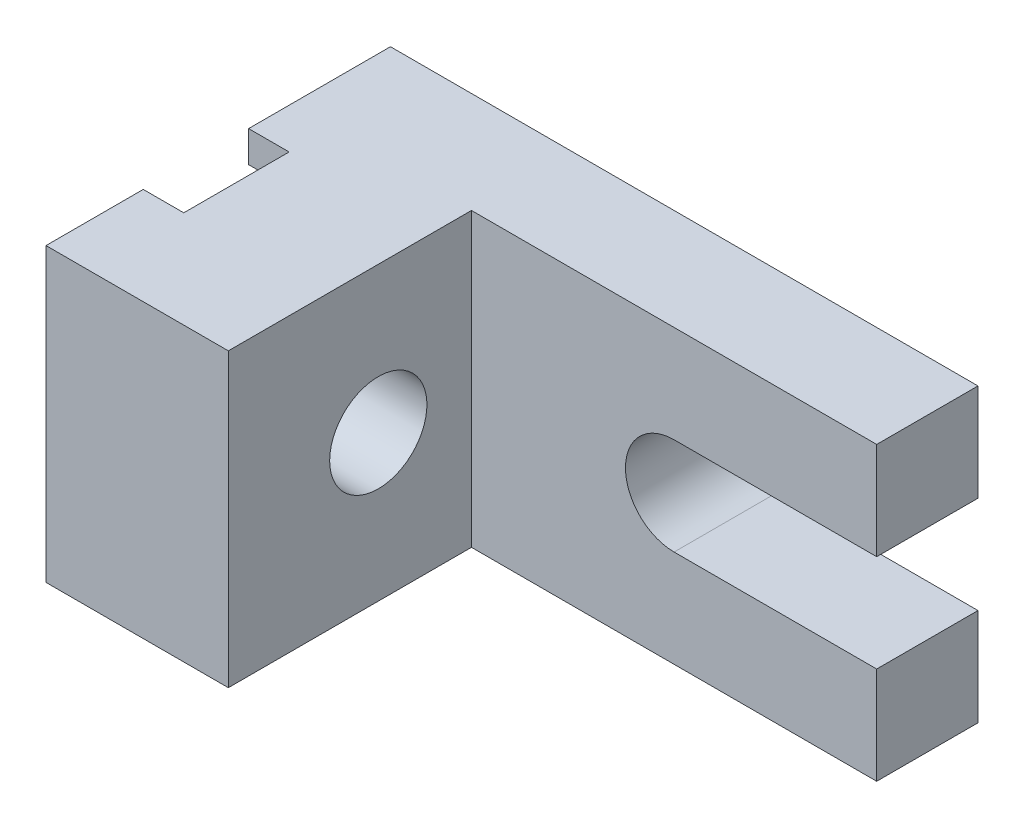
ISO-10303-21;
HEADER;
FILE_DESCRIPTION(('STEP AP214'),'2;1');
FILE_NAME('part.step','',(''),(''),'','','');
FILE_SCHEMA(('AUTOMOTIVE_DESIGN { 1 0 10303 214 1 1 1 1 }'));
ENDSEC;
DATA;
#1=APPLICATION_CONTEXT('core data for automotive mechanical design processes');
#2=APPLICATION_PROTOCOL_DEFINITION('international standard','automotive_design',2000,#1);
#3=PRODUCT_CONTEXT('',#1,'mechanical');
#4=PRODUCT('Part','Part','',(#3));
#5=PRODUCT_RELATED_PRODUCT_CATEGORY('part','',(#4));
#6=PRODUCT_DEFINITION_FORMATION('','',#4);
#7=PRODUCT_DEFINITION_CONTEXT('part definition',#1,'design');
#8=PRODUCT_DEFINITION('design','',#6,#7);
#9=PRODUCT_DEFINITION_SHAPE('','',#8);
#10=(LENGTH_UNIT() NAMED_UNIT(*) SI_UNIT(.MILLI.,.METRE.));
#11=(NAMED_UNIT(*) PLANE_ANGLE_UNIT() SI_UNIT($,.RADIAN.));
#12=(NAMED_UNIT(*) SI_UNIT($,.STERADIAN.) SOLID_ANGLE_UNIT());
#13=UNCERTAINTY_MEASURE_WITH_UNIT(LENGTH_MEASURE(1.E-05),#10,'distance_accuracy_value','');
#14=(GEOMETRIC_REPRESENTATION_CONTEXT(3) GLOBAL_UNCERTAINTY_ASSIGNED_CONTEXT((#13)) GLOBAL_UNIT_ASSIGNED_CONTEXT((#10,
#11,#12)) REPRESENTATION_CONTEXT('',''));
#15=CARTESIAN_POINT('',(0.,0.,0.));
#16=DIRECTION('',(0.,0.,1.));
#17=DIRECTION('',(1.,0.,0.));
#18=AXIS2_PLACEMENT_3D('',#15,#16,#17);
#19=CARTESIAN_POINT('',(-9.99999999999999,-72.,35.));
#20=DIRECTION('',(0.,0.,-1.));
#21=DIRECTION('',(-1.,0.,0.));
#22=AXIS2_PLACEMENT_3D('',#19,#20,#21);
#23=PLANE('',#22);
#24=DIRECTION('',(0.,1.,0.));
#25=VECTOR('',#24,1.);
#26=CARTESIAN_POINT('',(0.,-72.,35.));
#27=LINE('',#26,#25);
#28=CARTESIAN_POINT('',(0.,-72.,35.));
#29=VERTEX_POINT('',#28);
#30=CARTESIAN_POINT('',(0.,-64.2842712474619,35.));
#31=VERTEX_POINT('',#30);
#32=EDGE_CURVE('E204',#29,#31,#27,.T.);
#33=ORIENTED_EDGE('',*,*,#32,.T.);
#34=DIRECTION('',(-1.,0.,0.));
#35=VECTOR('',#34,1.);
#36=CARTESIAN_POINT('',(0.,-64.2842712474619,35.));
#37=LINE('',#36,#35);
#38=CARTESIAN_POINT('',(-9.99999999999999,-64.2842712474619,35.));
#39=VERTEX_POINT('',#38);
#40=EDGE_CURVE('E185',#31,#39,#37,.T.);
#41=ORIENTED_EDGE('',*,*,#40,.T.);
#42=DIRECTION('',(0.,1.,0.));
#43=VECTOR('',#42,1.);
#44=CARTESIAN_POINT('',(-9.99999999999999,-72.,35.));
#45=LINE('',#44,#43);
#46=CARTESIAN_POINT('',(-9.99999999999999,-72.,35.));
#47=VERTEX_POINT('',#46);
#48=EDGE_CURVE('E306',#47,#39,#45,.T.);
#49=ORIENTED_EDGE('',*,*,#48,.F.);
#50=DIRECTION('',(1.,0.,0.));
#51=VECTOR('',#50,1.);
#52=CARTESIAN_POINT('',(-9.99999999999999,-72.,35.));
#53=LINE('',#52,#51);
#54=EDGE_CURVE('E217',#47,#29,#53,.T.);
#55=ORIENTED_EDGE('',*,*,#54,.T.);
#56=EDGE_LOOP('',(#33,#41,#49,#55));
#57=FACE_BOUND('',#56,.T.);
#58=ADVANCED_FACE('F37',(#57),#23,.F.);
#59=CARTESIAN_POINT('',(0.,0.,61.));
#60=DIRECTION('',(0.,0.,-1.));
#61=DIRECTION('',(-1.,0.,0.));
#62=AXIS2_PLACEMENT_3D('',#59,#60,#61);
#63=PLANE('',#62);
#64=DIRECTION('',(-1.,0.,0.));
#65=VECTOR('',#64,1.);
#66=CARTESIAN_POINT('',(0.,-61.377155080899,61.));
#67=LINE('',#66,#65);
#68=CARTESIAN_POINT('',(0.,-61.377155080899,61.));
#69=VERTEX_POINT('',#68);
#70=CARTESIAN_POINT('',(-9.99999999999999,-61.377155080899,61.));
#71=VERTEX_POINT('',#70);
#72=EDGE_CURVE('E61',#69,#71,#67,.T.);
#73=ORIENTED_EDGE('',*,*,#72,.F.);
#74=DIRECTION('',(0.,-1.,0.));
#75=VECTOR('',#74,1.);
#76=CARTESIAN_POINT('',(0.,0.,61.));
#77=LINE('',#76,#75);
#78=CARTESIAN_POINT('',(0.,-72.,61.));
#79=VERTEX_POINT('',#78);
#80=EDGE_CURVE('E645',#69,#79,#77,.T.);
#81=ORIENTED_EDGE('',*,*,#80,.T.);
#82=DIRECTION('',(1.,0.,0.));
#83=VECTOR('',#82,1.);
#84=CARTESIAN_POINT('',(0.,-72.,61.));
#85=LINE('',#84,#83);
#86=CARTESIAN_POINT('',(-9.99999999999999,-72.,61.));
#87=VERTEX_POINT('',#86);
#88=EDGE_CURVE('E656',#87,#79,#85,.T.);
#89=ORIENTED_EDGE('',*,*,#88,.F.);
#90=DIRECTION('',(0.,-1.,0.));
#91=VECTOR('',#90,1.);
#92=CARTESIAN_POINT('',(-9.99999999999999,0.,61.));
#93=LINE('',#92,#91);
#94=EDGE_CURVE('E646',#71,#87,#93,.T.);
#95=ORIENTED_EDGE('',*,*,#94,.F.);
#96=EDGE_LOOP('',(#73,#81,#89,#95));
#97=FACE_BOUND('',#96,.T.);
#98=ADVANCED_FACE('F358',(#97),#63,.T.);
#99=CARTESIAN_POINT('',(0.,0.,25.));
#100=DIRECTION('',(0.,0.,1.));
#101=DIRECTION('',(1.,0.,0.));
#102=AXIS2_PLACEMENT_3D('',#99,#100,#101);
#103=PLANE('',#102);
#104=DIRECTION('',(-1.,0.,0.));
#105=VECTOR('',#104,1.);
#106=CARTESIAN_POINT('',(0.,0.,25.));
#107=LINE('',#106,#105);
#108=CARTESIAN_POINT('',(135.,0.,25.));
#109=VERTEX_POINT('',#108);
#110=CARTESIAN_POINT('',(35.,0.,25.));
#111=VERTEX_POINT('',#110);
#112=EDGE_CURVE('E265',#109,#111,#107,.T.);
#113=ORIENTED_EDGE('',*,*,#112,.T.);
#114=DIRECTION('',(0.,1.,0.));
#115=VECTOR('',#114,1.);
#116=CARTESIAN_POINT('',(35.,-72.,25.));
#117=LINE('',#116,#115);
#118=CARTESIAN_POINT('',(35.,-72.,25.));
#119=VERTEX_POINT('',#118);
#120=EDGE_CURVE('E320',#119,#111,#117,.T.);
#121=ORIENTED_EDGE('',*,*,#120,.F.);
#122=DIRECTION('',(1.,0.,0.));
#123=VECTOR('',#122,1.);
#124=CARTESIAN_POINT('',(0.,-72.,25.));
#125=LINE('',#124,#123);
#126=CARTESIAN_POINT('',(135.,-72.,25.));
#127=VERTEX_POINT('',#126);
#128=EDGE_CURVE('E258',#119,#127,#125,.T.);
#129=ORIENTED_EDGE('',*,*,#128,.T.);
#130=DIRECTION('',(0.,1.,0.));
#131=VECTOR('',#130,1.);
#132=CARTESIAN_POINT('',(135.,0.,25.));
#133=LINE('',#132,#131);
#134=CARTESIAN_POINT('',(135.,-48.,25.));
#135=VERTEX_POINT('',#134);
#136=EDGE_CURVE('E262',#127,#135,#133,.T.);
#137=ORIENTED_EDGE('',*,*,#136,.T.);
#138=DIRECTION('',(-1.,0.,0.));
#139=VECTOR('',#138,1.);
#140=CARTESIAN_POINT('',(0.,-48.,25.));
#141=LINE('',#140,#139);
#142=CARTESIAN_POINT('',(85.,-48.,25.));
#143=VERTEX_POINT('',#142);
#144=EDGE_CURVE('E238',#135,#143,#141,.T.);
#145=ORIENTED_EDGE('',*,*,#144,.T.);
#146=CARTESIAN_POINT('',(85.,-36.,25.));
#147=DIRECTION('',(0.,0.,1.));
#148=DIRECTION('',(1.,0.,0.));
#149=AXIS2_PLACEMENT_3D('',#146,#147,#148);
#150=CIRCLE('',#149,12.);
#151=CARTESIAN_POINT('',(85.,-24.,25.));
#152=VERTEX_POINT('',#151);
#153=EDGE_CURVE('E241',#143,#152,#150,.F.);
#154=ORIENTED_EDGE('',*,*,#153,.T.);
#155=DIRECTION('',(1.,0.,0.));
#156=VECTOR('',#155,1.);
#157=CARTESIAN_POINT('',(0.,-24.,25.));
#158=LINE('',#157,#156);
#159=CARTESIAN_POINT('',(135.,-24.,25.));
#160=VERTEX_POINT('',#159);
#161=EDGE_CURVE('E244',#152,#160,#158,.T.);
#162=ORIENTED_EDGE('',*,*,#161,.T.);
#163=EDGE_CURVE('E260',#160,#109,#133,.T.);
#164=ORIENTED_EDGE('',*,*,#163,.T.);
#165=EDGE_LOOP('',(#113,#121,#129,#137,#145,#154,#162,#164));
#166=FACE_BOUND('',#165,.T.);
#167=ADVANCED_FACE('F331',(#166),#103,.T.);
#168=CARTESIAN_POINT('',(135.,0.,25.));
#169=DIRECTION('',(-1.,0.,0.));
#170=DIRECTION('',(0.,0.,1.));
#171=AXIS2_PLACEMENT_3D('',#168,#169,#170);
#172=PLANE('',#171);
#173=DIRECTION('',(0.,0.,-1.));
#174=VECTOR('',#173,1.);
#175=CARTESIAN_POINT('',(135.,-24.,153.));
#176=LINE('',#175,#174);
#177=CARTESIAN_POINT('',(135.,-24.,0.));
#178=VERTEX_POINT('',#177);
#179=EDGE_CURVE('E235',#160,#178,#176,.T.);
#180=ORIENTED_EDGE('',*,*,#179,.T.);
#181=DIRECTION('',(0.,1.,0.));
#182=VECTOR('',#181,1.);
#183=CARTESIAN_POINT('',(135.,0.,0.));
#184=LINE('',#183,#182);
#185=CARTESIAN_POINT('',(135.,0.,0.));
#186=VERTEX_POINT('',#185);
#187=EDGE_CURVE('E269',#178,#186,#184,.T.);
#188=ORIENTED_EDGE('',*,*,#187,.T.);
#189=DIRECTION('',(0.,0.,-1.));
#190=VECTOR('',#189,1.);
#191=CARTESIAN_POINT('',(135.,0.,25.));
#192=LINE('',#191,#190);
#193=EDGE_CURVE('E46',#109,#186,#192,.T.);
#194=ORIENTED_EDGE('',*,*,#193,.F.);
#195=ORIENTED_EDGE('',*,*,#163,.F.);
#196=EDGE_LOOP('',(#180,#188,#194,#195));
#197=FACE_BOUND('',#196,.T.);
#198=ADVANCED_FACE('F352',(#197),#172,.F.);
#199=DIRECTION('',(0.,0.,-1.));
#200=VECTOR('',#199,1.);
#201=CARTESIAN_POINT('',(135.,-48.,153.));
#202=LINE('',#201,#200);
#203=CARTESIAN_POINT('',(135.,-48.,0.));
#204=VERTEX_POINT('',#203);
#205=EDGE_CURVE('E229',#135,#204,#202,.T.);
#206=ORIENTED_EDGE('',*,*,#205,.F.);
#207=ORIENTED_EDGE('',*,*,#136,.F.);
#208=DIRECTION('',(0.,0.,-1.));
#209=VECTOR('',#208,1.);
#210=CARTESIAN_POINT('',(135.,-72.,25.));
#211=LINE('',#210,#209);
#212=CARTESIAN_POINT('',(135.,-72.,0.));
#213=VERTEX_POINT('',#212);
#214=EDGE_CURVE('E11',#127,#213,#211,.T.);
#215=ORIENTED_EDGE('',*,*,#214,.T.);
#216=EDGE_CURVE('E270',#213,#204,#184,.T.);
#217=ORIENTED_EDGE('',*,*,#216,.T.);
#218=EDGE_LOOP('',(#206,#207,#215,#217));
#219=FACE_BOUND('',#218,.T.);
#220=ADVANCED_FACE('F341',(#219),#172,.F.);
#221=CARTESIAN_POINT('',(0.,0.,0.));
#222=DIRECTION('',(0.,0.,1.));
#223=DIRECTION('',(1.,0.,0.));
#224=AXIS2_PLACEMENT_3D('',#221,#222,#223);
#225=PLANE('',#224);
#226=DIRECTION('',(-1.,0.,0.));
#227=VECTOR('',#226,1.);
#228=CARTESIAN_POINT('',(135.,-24.,0.));
#229=LINE('',#228,#227);
#230=CARTESIAN_POINT('',(85.,-24.,0.));
#231=VERTEX_POINT('',#230);
#232=EDGE_CURVE('E220',#178,#231,#229,.T.);
#233=ORIENTED_EDGE('',*,*,#232,.T.);
#234=CARTESIAN_POINT('',(85.,-36.,0.));
#235=DIRECTION('',(0.,0.,1.));
#236=DIRECTION('',(1.,0.,0.));
#237=AXIS2_PLACEMENT_3D('',#234,#235,#236);
#238=CIRCLE('',#237,12.);
#239=CARTESIAN_POINT('',(85.,-48.,0.));
#240=VERTEX_POINT('',#239);
#241=EDGE_CURVE('E223',#231,#240,#238,.T.);
#242=ORIENTED_EDGE('',*,*,#241,.T.);
#243=DIRECTION('',(1.,0.,0.));
#244=VECTOR('',#243,1.);
#245=CARTESIAN_POINT('',(85.,-48.,0.));
#246=LINE('',#245,#244);
#247=EDGE_CURVE('E226',#240,#204,#246,.T.);
#248=ORIENTED_EDGE('',*,*,#247,.T.);
#249=ORIENTED_EDGE('',*,*,#216,.F.);
#250=DIRECTION('',(1.,0.,0.));
#251=VECTOR('',#250,1.);
#252=CARTESIAN_POINT('',(0.,-72.,0.));
#253=LINE('',#252,#251);
#254=CARTESIAN_POINT('',(60.,-72.,0.));
#255=VERTEX_POINT('',#254);
#256=EDGE_CURVE('E256',#255,#213,#253,.T.);
#257=ORIENTED_EDGE('',*,*,#256,.F.);
#258=DIRECTION('',(0.,-1.,0.));
#259=VECTOR('',#258,1.);
#260=CARTESIAN_POINT('',(60.,0.,0.));
#261=LINE('',#260,#259);
#262=CARTESIAN_POINT('',(60.0000000000001,-22.,0.));
#263=VERTEX_POINT('',#262);
#264=EDGE_CURVE('E253',#263,#255,#261,.T.);
#265=ORIENTED_EDGE('',*,*,#264,.F.);
#266=DIRECTION('',(-1.,0.,0.));
#267=VECTOR('',#266,1.);
#268=CARTESIAN_POINT('',(60.0000000000001,-22.,0.));
#269=LINE('',#268,#267);
#270=CARTESIAN_POINT('',(-10.,-22.,0.));
#271=VERTEX_POINT('',#270);
#272=EDGE_CURVE('E209',#263,#271,#269,.T.);
#273=ORIENTED_EDGE('',*,*,#272,.T.);
#274=DIRECTION('',(0.,-1.,0.));
#275=VECTOR('',#274,1.);
#276=CARTESIAN_POINT('',(-10.,0.,0.));
#277=LINE('',#276,#275);
#278=CARTESIAN_POINT('',(-10.,0.,0.));
#279=VERTEX_POINT('',#278);
#280=EDGE_CURVE('E290',#279,#271,#277,.T.);
#281=ORIENTED_EDGE('',*,*,#280,.F.);
#282=DIRECTION('',(-1.,0.,0.));
#283=VECTOR('',#282,1.);
#284=CARTESIAN_POINT('',(0.,0.,0.));
#285=LINE('',#284,#283);
#286=EDGE_CURVE('E261',#186,#279,#285,.T.);
#287=ORIENTED_EDGE('',*,*,#286,.F.);
#288=ORIENTED_EDGE('',*,*,#187,.F.);
#289=EDGE_LOOP('',(#233,#242,#248,#249,#257,#265,#273,#281,#287,#288));
#290=FACE_BOUND('',#289,.T.);
#291=ADVANCED_FACE('F288',(#290),#225,.F.);
#292=CARTESIAN_POINT('',(0.,-72.,25.));
#293=DIRECTION('',(0.,1.,0.));
#294=DIRECTION('',(0.,0.,1.));
#295=AXIS2_PLACEMENT_3D('',#292,#293,#294);
#296=PLANE('',#295);
#297=ORIENTED_EDGE('',*,*,#128,.F.);
#298=DIRECTION('',(0.,0.,-1.));
#299=VECTOR('',#298,1.);
#300=CARTESIAN_POINT('',(35.,-72.,85.));
#301=LINE('',#300,#299);
#302=CARTESIAN_POINT('',(35.,-72.,85.));
#303=VERTEX_POINT('',#302);
#304=EDGE_CURVE('E299',#303,#119,#301,.T.);
#305=ORIENTED_EDGE('',*,*,#304,.F.);
#306=DIRECTION('',(1.,0.,0.));
#307=VECTOR('',#306,1.);
#308=CARTESIAN_POINT('',(0.,-72.,85.));
#309=LINE('',#308,#307);
#310=CARTESIAN_POINT('',(-9.99999999999999,-72.,85.));
#311=VERTEX_POINT('',#310);
#312=EDGE_CURVE('E333',#311,#303,#309,.T.);
#313=ORIENTED_EDGE('',*,*,#312,.F.);
#314=DIRECTION('',(0.,0.,-1.));
#315=VECTOR('',#314,1.);
#316=CARTESIAN_POINT('',(-9.99999999999999,-72.,85.));
#317=LINE('',#316,#315);
#318=EDGE_CURVE('E196',#311,#87,#317,.T.);
#319=ORIENTED_EDGE('',*,*,#318,.T.);
#320=ORIENTED_EDGE('',*,*,#88,.T.);
#321=DIRECTION('',(0.,0.,-1.));
#322=VECTOR('',#321,1.);
#323=CARTESIAN_POINT('',(0.,-72.,85.));
#324=LINE('',#323,#322);
#325=EDGE_CURVE('E295',#79,#29,#324,.T.);
#326=ORIENTED_EDGE('',*,*,#325,.T.);
#327=ORIENTED_EDGE('',*,*,#54,.F.);
#328=DIRECTION('',(0.,0.,1.));
#329=VECTOR('',#328,1.);
#330=CARTESIAN_POINT('',(-9.99999999999999,-72.,5.));
#331=LINE('',#330,#329);
#332=CARTESIAN_POINT('',(-9.99999999999999,-72.,5.));
#333=VERTEX_POINT('',#332);
#334=EDGE_CURVE('E305',#333,#47,#331,.T.);
#335=ORIENTED_EDGE('',*,*,#334,.F.);
#336=DIRECTION('',(-1.,0.,0.));
#337=VECTOR('',#336,1.);
#338=CARTESIAN_POINT('',(0.,-72.,5.));
#339=LINE('',#338,#337);
#340=CARTESIAN_POINT('',(60.,-72.,5.));
#341=VERTEX_POINT('',#340);
#342=EDGE_CURVE('E250',#341,#333,#339,.T.);
#343=ORIENTED_EDGE('',*,*,#342,.F.);
#344=DIRECTION('',(0.,0.,1.));
#345=VECTOR('',#344,1.);
#346=CARTESIAN_POINT('',(60.,-72.,0.));
#347=LINE('',#346,#345);
#348=EDGE_CURVE('E247',#255,#341,#347,.T.);
#349=ORIENTED_EDGE('',*,*,#348,.F.);
#350=ORIENTED_EDGE('',*,*,#256,.T.);
#351=ORIENTED_EDGE('',*,*,#214,.F.);
#352=EDGE_LOOP('',(#297,#305,#313,#319,#320,#326,#327,#335,#343,#349,#350,#351));
#353=FACE_BOUND('',#352,.T.);
#354=ADVANCED_FACE('F39',(#353),#296,.F.);
#355=CARTESIAN_POINT('',(0.,0.,25.));
#356=DIRECTION('',(0.,-1.,0.));
#357=DIRECTION('',(0.,0.,-1.));
#358=AXIS2_PLACEMENT_3D('',#355,#356,#357);
#359=PLANE('',#358);
#360=ORIENTED_EDGE('',*,*,#286,.T.);
#361=DIRECTION('',(0.,0.,-1.));
#362=VECTOR('',#361,1.);
#363=CARTESIAN_POINT('',(-10.,0.,5.));
#364=LINE('',#363,#362);
#365=CARTESIAN_POINT('',(-10.,0.,35.));
#366=VERTEX_POINT('',#365);
#367=EDGE_CURVE('E213',#366,#279,#364,.T.);
#368=ORIENTED_EDGE('',*,*,#367,.F.);
#369=DIRECTION('',(1.,0.,0.));
#370=VECTOR('',#369,1.);
#371=CARTESIAN_POINT('',(-10.,0.,35.));
#372=LINE('',#371,#370);
#373=CARTESIAN_POINT('',(0.,0.,35.));
#374=VERTEX_POINT('',#373);
#375=EDGE_CURVE('E215',#366,#374,#372,.T.);
#376=ORIENTED_EDGE('',*,*,#375,.T.);
#377=DIRECTION('',(0.,0.,-1.));
#378=VECTOR('',#377,1.);
#379=CARTESIAN_POINT('',(0.,0.,85.));
#380=LINE('',#379,#378);
#381=CARTESIAN_POINT('',(0.,0.,61.));
#382=VERTEX_POINT('',#381);
#383=EDGE_CURVE('E202',#382,#374,#380,.T.);
#384=ORIENTED_EDGE('',*,*,#383,.F.);
#385=DIRECTION('',(1.,0.,0.));
#386=VECTOR('',#385,1.);
#387=CARTESIAN_POINT('',(0.,0.,61.));
#388=LINE('',#387,#386);
#389=CARTESIAN_POINT('',(-9.99999999999999,0.,61.));
#390=VERTEX_POINT('',#389);
#391=EDGE_CURVE('E312',#390,#382,#388,.T.);
#392=ORIENTED_EDGE('',*,*,#391,.F.);
#393=DIRECTION('',(0.,0.,-1.));
#394=VECTOR('',#393,1.);
#395=CARTESIAN_POINT('',(-9.99999999999999,0.,85.));
#396=LINE('',#395,#394);
#397=CARTESIAN_POINT('',(-9.99999999999999,0.,85.));
#398=VERTEX_POINT('',#397);
#399=EDGE_CURVE('E644',#398,#390,#396,.T.);
#400=ORIENTED_EDGE('',*,*,#399,.F.);
#401=DIRECTION('',(-1.,0.,0.));
#402=VECTOR('',#401,1.);
#403=CARTESIAN_POINT('',(0.,0.,85.));
#404=LINE('',#403,#402);
#405=CARTESIAN_POINT('',(35.,0.,85.));
#406=VERTEX_POINT('',#405);
#407=EDGE_CURVE('E314',#406,#398,#404,.T.);
#408=ORIENTED_EDGE('',*,*,#407,.F.);
#409=DIRECTION('',(0.,0.,-1.));
#410=VECTOR('',#409,1.);
#411=CARTESIAN_POINT('',(35.,0.,85.));
#412=LINE('',#411,#410);
#413=EDGE_CURVE('E313',#406,#111,#412,.T.);
#414=ORIENTED_EDGE('',*,*,#413,.T.);
#415=ORIENTED_EDGE('',*,*,#112,.F.);
#416=ORIENTED_EDGE('',*,*,#193,.T.);
#417=EDGE_LOOP('',(#360,#368,#376,#384,#392,#400,#408,#414,#415,#416));
#418=FACE_BOUND('',#417,.T.);
#419=ADVANCED_FACE('F279',(#418),#359,.F.);
#420=CARTESIAN_POINT('',(0.,0.,5.));
#421=DIRECTION('',(0.,0.,1.));
#422=DIRECTION('',(1.,0.,0.));
#423=AXIS2_PLACEMENT_3D('',#420,#421,#422);
#424=PLANE('',#423);
#425=DIRECTION('',(0.,-1.,0.));
#426=VECTOR('',#425,1.);
#427=CARTESIAN_POINT('',(-9.99999999999999,-72.,5.));
#428=LINE('',#427,#426);
#429=CARTESIAN_POINT('',(-10.,-22.,5.));
#430=VERTEX_POINT('',#429);
#431=EDGE_CURVE('E207',#430,#333,#428,.T.);
#432=ORIENTED_EDGE('',*,*,#431,.F.);
#433=DIRECTION('',(-1.,0.,0.));
#434=VECTOR('',#433,1.);
#435=CARTESIAN_POINT('',(60.0000000000001,-22.,4.99999999999999));
#436=LINE('',#435,#434);
#437=CARTESIAN_POINT('',(60.0000000000001,-22.,4.99999999999999));
#438=VERTEX_POINT('',#437);
#439=EDGE_CURVE('E205',#438,#430,#436,.T.);
#440=ORIENTED_EDGE('',*,*,#439,.F.);
#441=DIRECTION('',(0.,-1.,0.));
#442=VECTOR('',#441,1.);
#443=CARTESIAN_POINT('',(60.,0.,5.));
#444=LINE('',#443,#442);
#445=EDGE_CURVE('E254',#438,#341,#444,.T.);
#446=ORIENTED_EDGE('',*,*,#445,.T.);
#447=ORIENTED_EDGE('',*,*,#342,.T.);
#448=EDGE_LOOP('',(#432,#440,#446,#447));
#449=FACE_BOUND('',#448,.T.);
#450=ADVANCED_FACE('F386',(#449),#424,.F.);
#451=CARTESIAN_POINT('',(60.,0.,0.));
#452=DIRECTION('',(1.,0.,0.));
#453=DIRECTION('',(0.,0.,-1.));
#454=AXIS2_PLACEMENT_3D('',#451,#452,#453);
#455=PLANE('',#454);
#456=ORIENTED_EDGE('',*,*,#445,.F.);
#457=DIRECTION('',(0.,0.,1.));
#458=VECTOR('',#457,1.);
#459=CARTESIAN_POINT('',(60.0000000000001,-22.,4.99999999999999));
#460=LINE('',#459,#458);
#461=EDGE_CURVE('E297',#263,#438,#460,.T.);
#462=ORIENTED_EDGE('',*,*,#461,.F.);
#463=ORIENTED_EDGE('',*,*,#264,.T.);
#464=ORIENTED_EDGE('',*,*,#348,.T.);
#465=EDGE_LOOP('',(#456,#462,#463,#464));
#466=FACE_BOUND('',#465,.T.);
#467=ADVANCED_FACE('F385',(#466),#455,.F.);
#468=CARTESIAN_POINT('',(135.,-24.,153.));
#469=DIRECTION('',(0.,-1.,0.));
#470=DIRECTION('',(1.,0.,0.));
#471=AXIS2_PLACEMENT_3D('',#468,#469,#470);
#472=PLANE('',#471);
#473=DIRECTION('',(0.,0.,-1.));
#474=VECTOR('',#473,1.);
#475=CARTESIAN_POINT('',(85.,-24.,153.));
#476=LINE('',#475,#474);
#477=EDGE_CURVE('E233',#152,#231,#476,.T.);
#478=ORIENTED_EDGE('',*,*,#477,.T.);
#479=ORIENTED_EDGE('',*,*,#232,.F.);
#480=ORIENTED_EDGE('',*,*,#179,.F.);
#481=ORIENTED_EDGE('',*,*,#161,.F.);
#482=EDGE_LOOP('',(#478,#479,#480,#481));
#483=FACE_BOUND('',#482,.T.);
#484=ADVANCED_FACE('F351',(#483),#472,.T.);
#485=CARTESIAN_POINT('',(85.,-36.,153.));
#486=DIRECTION('',(0.,0.,-1.));
#487=DIRECTION('',(-1.,0.,0.));
#488=AXIS2_PLACEMENT_3D('',#485,#486,#487);
#489=CYLINDRICAL_SURFACE('',#488,12.);
#490=DIRECTION('',(0.,0.,-1.));
#491=VECTOR('',#490,1.);
#492=CARTESIAN_POINT('',(85.,-48.,153.));
#493=LINE('',#492,#491);
#494=EDGE_CURVE('E231',#143,#240,#493,.T.);
#495=ORIENTED_EDGE('',*,*,#494,.T.);
#496=ORIENTED_EDGE('',*,*,#241,.F.);
#497=ORIENTED_EDGE('',*,*,#477,.F.);
#498=ORIENTED_EDGE('',*,*,#153,.F.);
#499=EDGE_LOOP('',(#495,#496,#497,#498));
#500=FACE_BOUND('',#499,.T.);
#501=ADVANCED_FACE('F348',(#500),#489,.F.);
#502=CARTESIAN_POINT('',(85.,-48.,153.));
#503=DIRECTION('',(0.,1.,0.));
#504=DIRECTION('',(-1.,0.,0.));
#505=AXIS2_PLACEMENT_3D('',#502,#503,#504);
#506=PLANE('',#505);
#507=ORIENTED_EDGE('',*,*,#205,.T.);
#508=ORIENTED_EDGE('',*,*,#247,.F.);
#509=ORIENTED_EDGE('',*,*,#494,.F.);
#510=ORIENTED_EDGE('',*,*,#144,.F.);
#511=EDGE_LOOP('',(#507,#508,#509,#510));
#512=FACE_BOUND('',#511,.T.);
#513=ADVANCED_FACE('F344',(#512),#506,.T.);
#514=CARTESIAN_POINT('',(-10.,-7.7157287525381,35.));
#515=VERTEX_POINT('',#514);
#516=EDGE_CURVE('E195',#515,#366,#45,.T.);
#517=ORIENTED_EDGE('',*,*,#516,.F.);
#518=DIRECTION('',(-1.,0.,0.));
#519=VECTOR('',#518,1.);
#520=CARTESIAN_POINT('',(0.,-7.7157287525381,35.));
#521=LINE('',#520,#519);
#522=CARTESIAN_POINT('',(0.,-7.7157287525381,35.));
#523=VERTEX_POINT('',#522);
#524=EDGE_CURVE('E182',#523,#515,#521,.T.);
#525=ORIENTED_EDGE('',*,*,#524,.F.);
#526=EDGE_CURVE('E193',#523,#374,#27,.T.);
#527=ORIENTED_EDGE('',*,*,#526,.T.);
#528=ORIENTED_EDGE('',*,*,#375,.F.);
#529=EDGE_LOOP('',(#517,#525,#527,#528));
#530=FACE_BOUND('',#529,.T.);
#531=ADVANCED_FACE('F191',(#530),#23,.F.);
#532=CARTESIAN_POINT('',(-10.,0.,0.));
#533=DIRECTION('',(1.,0.,0.));
#534=DIRECTION('',(0.,1.,0.));
#535=AXIS2_PLACEMENT_3D('',#532,#533,#534);
#536=PLANE('',#535);
#537=ORIENTED_EDGE('',*,*,#48,.T.);
#538=CARTESIAN_POINT('',(-9.99999999999999,-36.,45.));
#539=DIRECTION('',(-1.,0.,0.));
#540=DIRECTION('',(0.,-1.,0.));
#541=AXIS2_PLACEMENT_3D('',#538,#539,#540);
#542=CIRCLE('',#541,30.);
#543=EDGE_CURVE('E187',#515,#39,#542,.T.);
#544=ORIENTED_EDGE('',*,*,#543,.F.);
#545=ORIENTED_EDGE('',*,*,#516,.T.);
#546=ORIENTED_EDGE('',*,*,#367,.T.);
#547=ORIENTED_EDGE('',*,*,#280,.T.);
#548=DIRECTION('',(0.,0.,1.));
#549=VECTOR('',#548,1.);
#550=CARTESIAN_POINT('',(-10.,-22.,4.99999999999999));
#551=LINE('',#550,#549);
#552=EDGE_CURVE('E294',#271,#430,#551,.T.);
#553=ORIENTED_EDGE('',*,*,#552,.T.);
#554=ORIENTED_EDGE('',*,*,#431,.T.);
#555=ORIENTED_EDGE('',*,*,#334,.T.);
#556=EDGE_LOOP('',(#537,#544,#545,#546,#547,#553,#554,#555));
#557=FACE_BOUND('',#556,.T.);
#558=ADVANCED_FACE('F309',(#557),#536,.F.);
#559=CARTESIAN_POINT('',(60.0000000000001,-22.,4.99999999999999));
#560=DIRECTION('',(0.,-1.,0.));
#561=DIRECTION('',(1.,0.,0.));
#562=AXIS2_PLACEMENT_3D('',#559,#560,#561);
#563=PLANE('',#562);
#564=ORIENTED_EDGE('',*,*,#552,.F.);
#565=ORIENTED_EDGE('',*,*,#272,.F.);
#566=ORIENTED_EDGE('',*,*,#461,.T.);
#567=ORIENTED_EDGE('',*,*,#439,.T.);
#568=EDGE_LOOP('',(#564,#565,#566,#567));
#569=FACE_BOUND('',#568,.T.);
#570=ADVANCED_FACE('F377',(#569),#563,.T.);
#571=CARTESIAN_POINT('',(0.,-72.,85.));
#572=DIRECTION('',(1.,0.,0.));
#573=DIRECTION('',(0.,0.,-1.));
#574=AXIS2_PLACEMENT_3D('',#571,#572,#573);
#575=PLANE('',#574);
#576=CARTESIAN_POINT('',(0.,-36.0000000000007,48.0000000000009));
#577=DIRECTION('',(-1.,0.,0.));
#578=DIRECTION('',(0.,0.,1.));
#579=AXIS2_PLACEMENT_3D('',#576,#577,#578);
#580=CIRCLE('',#579,12.);
#581=CARTESIAN_POINT('',(0.,-36.0000000000007,60.0000000000009));
#582=VERTEX_POINT('',#581);
#583=EDGE_CURVE('E674',#582,#582,#580,.T.);
#584=ORIENTED_EDGE('',*,*,#583,.F.);
#585=EDGE_LOOP('',(#584));
#586=FACE_BOUND('',#585,.T.);
#587=ORIENTED_EDGE('',*,*,#325,.F.);
#588=ORIENTED_EDGE('',*,*,#80,.F.);
#589=CARTESIAN_POINT('',(0.,-36.,45.));
#590=DIRECTION('',(-1.,0.,0.));
#591=DIRECTION('',(0.,-1.,0.));
#592=AXIS2_PLACEMENT_3D('',#589,#590,#591);
#593=CIRCLE('',#592,30.);
#594=CARTESIAN_POINT('',(0.,-10.622844919101,61.));
#595=VERTEX_POINT('',#594);
#596=EDGE_CURVE('E639',#69,#595,#593,.T.);
#597=ORIENTED_EDGE('',*,*,#596,.T.);
#598=EDGE_CURVE('E334',#382,#595,#77,.T.);
#599=ORIENTED_EDGE('',*,*,#598,.F.);
#600=ORIENTED_EDGE('',*,*,#383,.T.);
#601=ORIENTED_EDGE('',*,*,#526,.F.);
#602=CARTESIAN_POINT('',(0.,-36.,45.));
#603=DIRECTION('',(-1.,0.,0.));
#604=DIRECTION('',(0.,-1.,0.));
#605=AXIS2_PLACEMENT_3D('',#602,#603,#604);
#606=CIRCLE('',#605,30.);
#607=EDGE_CURVE('E53',#523,#31,#606,.T.);
#608=ORIENTED_EDGE('',*,*,#607,.T.);
#609=ORIENTED_EDGE('',*,*,#32,.F.);
#610=EDGE_LOOP('',(#587,#588,#597,#599,#600,#601,#608,#609));
#611=FACE_BOUND('',#610,.T.);
#612=ADVANCED_FACE('F199',(#586,#611),#575,.F.);
#613=CARTESIAN_POINT('',(35.,-72.,85.));
#614=DIRECTION('',(-1.,0.,0.));
#615=DIRECTION('',(0.,-1.,0.));
#616=AXIS2_PLACEMENT_3D('',#613,#614,#615);
#617=PLANE('',#616);
#618=CARTESIAN_POINT('',(35.,-36.0000000000007,48.0000000000009));
#619=DIRECTION('',(-1.,0.,0.));
#620=DIRECTION('',(0.,-1.,0.));
#621=AXIS2_PLACEMENT_3D('',#618,#619,#620);
#622=CIRCLE('',#621,12.);
#623=CARTESIAN_POINT('',(35.,-48.0000000000007,48.0000000000009));
#624=VERTEX_POINT('',#623);
#625=EDGE_CURVE('E41',#624,#624,#622,.T.);
#626=ORIENTED_EDGE('',*,*,#625,.T.);
#627=EDGE_LOOP('',(#626));
#628=FACE_BOUND('',#627,.T.);
#629=ORIENTED_EDGE('',*,*,#120,.T.);
#630=ORIENTED_EDGE('',*,*,#413,.F.);
#631=DIRECTION('',(0.,1.,0.));
#632=VECTOR('',#631,1.);
#633=CARTESIAN_POINT('',(35.,-72.,85.));
#634=LINE('',#633,#632);
#635=EDGE_CURVE('E317',#303,#406,#634,.T.);
#636=ORIENTED_EDGE('',*,*,#635,.F.);
#637=ORIENTED_EDGE('',*,*,#304,.T.);
#638=EDGE_LOOP('',(#629,#630,#636,#637));
#639=FACE_BOUND('',#638,.T.);
#640=ADVANCED_FACE('F326',(#628,#639),#617,.F.);
#641=CARTESIAN_POINT('',(0.,0.,85.));
#642=DIRECTION('',(0.,0.,-1.));
#643=DIRECTION('',(-1.,0.,0.));
#644=AXIS2_PLACEMENT_3D('',#641,#642,#643);
#645=PLANE('',#644);
#646=ORIENTED_EDGE('',*,*,#407,.T.);
#647=DIRECTION('',(0.,-1.,0.));
#648=VECTOR('',#647,1.);
#649=CARTESIAN_POINT('',(-9.99999999999999,0.,85.));
#650=LINE('',#649,#648);
#651=EDGE_CURVE('E649',#398,#311,#650,.T.);
#652=ORIENTED_EDGE('',*,*,#651,.T.);
#653=ORIENTED_EDGE('',*,*,#312,.T.);
#654=ORIENTED_EDGE('',*,*,#635,.T.);
#655=EDGE_LOOP('',(#646,#652,#653,#654));
#656=FACE_BOUND('',#655,.T.);
#657=ADVANCED_FACE('F529',(#656),#645,.F.);
#658=DIRECTION('',(-1.,0.,0.));
#659=VECTOR('',#658,1.);
#660=CARTESIAN_POINT('',(0.,-10.622844919101,61.));
#661=LINE('',#660,#659);
#662=CARTESIAN_POINT('',(-10.,-10.622844919101,61.));
#663=VERTEX_POINT('',#662);
#664=EDGE_CURVE('E634',#595,#663,#661,.T.);
#665=ORIENTED_EDGE('',*,*,#664,.T.);
#666=EDGE_CURVE('E636',#390,#663,#93,.T.);
#667=ORIENTED_EDGE('',*,*,#666,.F.);
#668=ORIENTED_EDGE('',*,*,#391,.T.);
#669=ORIENTED_EDGE('',*,*,#598,.T.);
#670=EDGE_LOOP('',(#665,#667,#668,#669));
#671=FACE_BOUND('',#670,.T.);
#672=ADVANCED_FACE('F369',(#671),#63,.T.);
#673=CARTESIAN_POINT('',(-9.99999999999999,0.,85.));
#674=DIRECTION('',(-1.,0.,0.));
#675=DIRECTION('',(0.,0.,1.));
#676=AXIS2_PLACEMENT_3D('',#673,#674,#675);
#677=PLANE('',#676);
#678=CARTESIAN_POINT('',(-9.99999999999999,-36.,45.));
#679=DIRECTION('',(-1.,0.,0.));
#680=DIRECTION('',(0.,-1.,0.));
#681=AXIS2_PLACEMENT_3D('',#678,#679,#680);
#682=CIRCLE('',#681,30.);
#683=EDGE_CURVE('E641',#71,#663,#682,.T.);
#684=ORIENTED_EDGE('',*,*,#683,.F.);
#685=ORIENTED_EDGE('',*,*,#94,.T.);
#686=ORIENTED_EDGE('',*,*,#318,.F.);
#687=ORIENTED_EDGE('',*,*,#651,.F.);
#688=ORIENTED_EDGE('',*,*,#399,.T.);
#689=ORIENTED_EDGE('',*,*,#666,.T.);
#690=EDGE_LOOP('',(#684,#685,#686,#687,#688,#689));
#691=FACE_BOUND('',#690,.T.);
#692=ADVANCED_FACE('F587',(#691),#677,.T.);
#693=CARTESIAN_POINT('',(0.,-36.,45.));
#694=DIRECTION('',(-1.,0.,0.));
#695=DIRECTION('',(0.,-1.,0.));
#696=AXIS2_PLACEMENT_3D('',#693,#694,#695);
#697=CYLINDRICAL_SURFACE('',#696,30.);
#698=ORIENTED_EDGE('',*,*,#683,.T.);
#699=ORIENTED_EDGE('',*,*,#664,.F.);
#700=ORIENTED_EDGE('',*,*,#596,.F.);
#701=ORIENTED_EDGE('',*,*,#72,.T.);
#702=EDGE_LOOP('',(#698,#699,#700,#701));
#703=FACE_BOUND('',#702,.T.);
#704=ADVANCED_FACE('F581',(#703),#697,.F.);
#705=CARTESIAN_POINT('',(0.,-36.,45.));
#706=DIRECTION('',(-1.,0.,0.));
#707=DIRECTION('',(0.,-1.,0.));
#708=AXIS2_PLACEMENT_3D('',#705,#706,#707);
#709=CYLINDRICAL_SURFACE('',#708,30.);
#710=ORIENTED_EDGE('',*,*,#543,.T.);
#711=ORIENTED_EDGE('',*,*,#40,.F.);
#712=ORIENTED_EDGE('',*,*,#607,.F.);
#713=ORIENTED_EDGE('',*,*,#524,.T.);
#714=EDGE_LOOP('',(#710,#711,#712,#713));
#715=FACE_BOUND('',#714,.T.);
#716=ADVANCED_FACE('F181',(#715),#709,.F.);
#717=CARTESIAN_POINT('',(42.,-36.0000000000007,48.0000000000009));
#718=DIRECTION('',(-1.,0.,0.));
#719=DIRECTION('',(0.,0.,1.));
#720=AXIS2_PLACEMENT_3D('',#717,#718,#719);
#721=CYLINDRICAL_SURFACE('',#720,12.);
#722=ORIENTED_EDGE('',*,*,#583,.T.);
#723=EDGE_LOOP('',(#722));
#724=FACE_BOUND('',#723,.T.);
#725=ORIENTED_EDGE('',*,*,#625,.F.);
#726=EDGE_LOOP('',(#725));
#727=FACE_BOUND('',#726,.T.);
#728=ADVANCED_FACE('F597',(#724,#727),#721,.F.);
#729=CLOSED_SHELL('',(#58,#98,#167,#198,#220,#291,#354,#419,#450,#467,#484,#501,#513,#531,#558,
#570,#612,#640,#657,#672,#692,#704,#716,#728));
#730=MANIFOLD_SOLID_BREP('B2',#729);
#731=ADVANCED_BREP_SHAPE_REPRESENTATION('',(#18,#730),#14);
#732=SHAPE_DEFINITION_REPRESENTATION(#9,#731);
ENDSEC;
END-ISO-10303-21;
